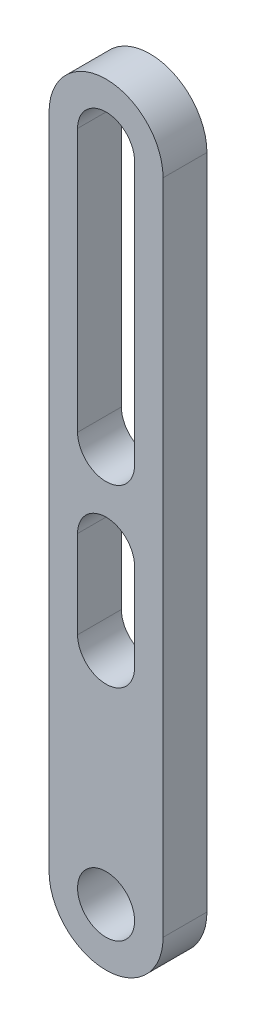
ISO-10303-21;
HEADER;
FILE_DESCRIPTION(('STEP AP214'),'2;1');
FILE_NAME('part.step','',(''),(''),'','','');
FILE_SCHEMA(('AUTOMOTIVE_DESIGN { 1 0 10303 214 1 1 1 1 }'));
ENDSEC;
DATA;
#1=APPLICATION_CONTEXT('core data for automotive mechanical design processes');
#2=APPLICATION_PROTOCOL_DEFINITION('international standard','automotive_design',2000,#1);
#3=PRODUCT_CONTEXT('',#1,'mechanical');
#4=PRODUCT('Part','Part','',(#3));
#5=PRODUCT_RELATED_PRODUCT_CATEGORY('part','',(#4));
#6=PRODUCT_DEFINITION_FORMATION('','',#4);
#7=PRODUCT_DEFINITION_CONTEXT('part definition',#1,'design');
#8=PRODUCT_DEFINITION('design','',#6,#7);
#9=PRODUCT_DEFINITION_SHAPE('','',#8);
#10=(LENGTH_UNIT() NAMED_UNIT(*) SI_UNIT(.MILLI.,.METRE.));
#11=(NAMED_UNIT(*) PLANE_ANGLE_UNIT() SI_UNIT($,.RADIAN.));
#12=(NAMED_UNIT(*) SI_UNIT($,.STERADIAN.) SOLID_ANGLE_UNIT());
#13=UNCERTAINTY_MEASURE_WITH_UNIT(LENGTH_MEASURE(1.E-05),#10,'distance_accuracy_value','');
#14=(GEOMETRIC_REPRESENTATION_CONTEXT(3) GLOBAL_UNCERTAINTY_ASSIGNED_CONTEXT((#13)) GLOBAL_UNIT_ASSIGNED_CONTEXT((#10,
#11,#12)) REPRESENTATION_CONTEXT('',''));
#15=CARTESIAN_POINT('',(0.,0.,0.));
#16=DIRECTION('',(0.,0.,1.));
#17=DIRECTION('',(1.,0.,0.));
#18=AXIS2_PLACEMENT_3D('',#15,#16,#17);
#19=CARTESIAN_POINT('',(0.,0.,5.));
#20=DIRECTION('',(0.,0.,1.));
#21=DIRECTION('',(1.,0.,0.));
#22=AXIS2_PLACEMENT_3D('',#19,#20,#21);
#23=PLANE('',#22);
#24=DIRECTION('',(0.,-1.,0.));
#25=VECTOR('',#24,1.);
#26=CARTESIAN_POINT('',(-3.25000000000001,75.,5.));
#27=LINE('',#26,#25);
#28=CARTESIAN_POINT('',(-3.25000000000001,75.,5.));
#29=VERTEX_POINT('',#28);
#30=CARTESIAN_POINT('',(-3.25,45.,5.));
#31=VERTEX_POINT('',#30);
#32=EDGE_CURVE('E157',#29,#31,#27,.T.);
#33=ORIENTED_EDGE('',*,*,#32,.F.);
#34=CARTESIAN_POINT('',(0.,75.,5.));
#35=DIRECTION('',(0.,0.,1.));
#36=DIRECTION('',(1.,0.,0.));
#37=AXIS2_PLACEMENT_3D('',#34,#35,#36);
#38=CIRCLE('',#37,3.25000000000001);
#39=CARTESIAN_POINT('',(3.25000000000001,75.,5.));
#40=VERTEX_POINT('',#39);
#41=EDGE_CURVE('E155',#40,#29,#38,.T.);
#42=ORIENTED_EDGE('',*,*,#41,.F.);
#43=DIRECTION('',(0.,1.,0.));
#44=VECTOR('',#43,1.);
#45=CARTESIAN_POINT('',(3.25,45.,5.));
#46=LINE('',#45,#44);
#47=CARTESIAN_POINT('',(3.25,45.,5.));
#48=VERTEX_POINT('',#47);
#49=EDGE_CURVE('E163',#48,#40,#46,.T.);
#50=ORIENTED_EDGE('',*,*,#49,.F.);
#51=CARTESIAN_POINT('',(0.,45.,5.));
#52=DIRECTION('',(0.,0.,1.));
#53=DIRECTION('',(1.,0.,0.));
#54=AXIS2_PLACEMENT_3D('',#51,#52,#53);
#55=CIRCLE('',#54,3.25);
#56=EDGE_CURVE('E160',#31,#48,#55,.T.);
#57=ORIENTED_EDGE('',*,*,#56,.F.);
#58=EDGE_LOOP('',(#33,#42,#50,#57));
#59=FACE_BOUND('',#58,.T.);
#60=CARTESIAN_POINT('',(0.,0.,5.));
#61=DIRECTION('',(0.,0.,1.));
#62=DIRECTION('',(1.,0.,0.));
#63=AXIS2_PLACEMENT_3D('',#60,#61,#62);
#64=CIRCLE('',#63,6.50000000000001);
#65=CARTESIAN_POINT('',(-6.50000000000001,0.,5.));
#66=VERTEX_POINT('',#65);
#67=CARTESIAN_POINT('',(6.50000000000001,0.,5.));
#68=VERTEX_POINT('',#67);
#69=EDGE_CURVE('E192',#66,#68,#64,.T.);
#70=ORIENTED_EDGE('',*,*,#69,.T.);
#71=DIRECTION('',(0.,1.,0.));
#72=VECTOR('',#71,1.);
#73=CARTESIAN_POINT('',(6.5,75.,5.));
#74=LINE('',#73,#72);
#75=CARTESIAN_POINT('',(6.5,75.,5.));
#76=VERTEX_POINT('',#75);
#77=EDGE_CURVE('E195',#68,#76,#74,.T.);
#78=ORIENTED_EDGE('',*,*,#77,.T.);
#79=CARTESIAN_POINT('',(0.,75.,5.));
#80=DIRECTION('',(0.,0.,1.));
#81=DIRECTION('',(1.,0.,0.));
#82=AXIS2_PLACEMENT_3D('',#79,#80,#81);
#83=CIRCLE('',#82,6.5);
#84=CARTESIAN_POINT('',(-6.5,75.,5.));
#85=VERTEX_POINT('',#84);
#86=EDGE_CURVE('E198',#76,#85,#83,.T.);
#87=ORIENTED_EDGE('',*,*,#86,.T.);
#88=DIRECTION('',(0.,-1.,0.));
#89=VECTOR('',#88,1.);
#90=CARTESIAN_POINT('',(-6.5,75.,5.));
#91=LINE('',#90,#89);
#92=EDGE_CURVE('E200',#85,#66,#91,.T.);
#93=ORIENTED_EDGE('',*,*,#92,.T.);
#94=EDGE_LOOP('',(#70,#78,#87,#93));
#95=FACE_BOUND('',#94,.T.);
#96=CARTESIAN_POINT('',(0.,0.,5.));
#97=DIRECTION('',(0.,0.,1.));
#98=DIRECTION('',(1.,0.,0.));
#99=AXIS2_PLACEMENT_3D('',#96,#97,#98);
#100=CIRCLE('',#99,3.25);
#101=CARTESIAN_POINT('',(3.25,0.,5.));
#102=VERTEX_POINT('',#101);
#103=EDGE_CURVE('E186',#102,#102,#100,.T.);
#104=ORIENTED_EDGE('',*,*,#103,.F.);
#105=EDGE_LOOP('',(#104));
#106=FACE_BOUND('',#105,.T.);
#107=DIRECTION('',(0.,-1.,0.));
#108=VECTOR('',#107,1.);
#109=CARTESIAN_POINT('',(-3.25000000000001,35.,5.));
#110=LINE('',#109,#108);
#111=CARTESIAN_POINT('',(-3.25000000000001,35.,5.));
#112=VERTEX_POINT('',#111);
#113=CARTESIAN_POINT('',(-3.25000000000001,25.,5.));
#114=VERTEX_POINT('',#113);
#115=EDGE_CURVE('E127',#112,#114,#110,.T.);
#116=ORIENTED_EDGE('',*,*,#115,.F.);
#117=CARTESIAN_POINT('',(0.,35.,5.));
#118=DIRECTION('',(0.,0.,1.));
#119=DIRECTION('',(1.,0.,0.));
#120=AXIS2_PLACEMENT_3D('',#117,#118,#119);
#121=CIRCLE('',#120,3.25000000000001);
#122=CARTESIAN_POINT('',(3.25000000000001,35.,5.));
#123=VERTEX_POINT('',#122);
#124=EDGE_CURVE('E119',#123,#112,#121,.T.);
#125=ORIENTED_EDGE('',*,*,#124,.F.);
#126=DIRECTION('',(0.,1.,0.));
#127=VECTOR('',#126,1.);
#128=CARTESIAN_POINT('',(3.25000000000001,35.,5.));
#129=LINE('',#128,#127);
#130=CARTESIAN_POINT('',(3.25000000000001,25.,5.));
#131=VERTEX_POINT('',#130);
#132=EDGE_CURVE('E141',#131,#123,#129,.T.);
#133=ORIENTED_EDGE('',*,*,#132,.F.);
#134=CARTESIAN_POINT('',(0.,25.,5.));
#135=DIRECTION('',(0.,0.,1.));
#136=DIRECTION('',(1.,0.,0.));
#137=AXIS2_PLACEMENT_3D('',#134,#135,#136);
#138=CIRCLE('',#137,3.25000000000001);
#139=EDGE_CURVE('E139',#114,#131,#138,.T.);
#140=ORIENTED_EDGE('',*,*,#139,.F.);
#141=EDGE_LOOP('',(#116,#125,#133,#140));
#142=FACE_BOUND('',#141,.T.);
#143=ADVANCED_FACE('F30',(#59,#95,#106,#142),#23,.T.);
#144=CARTESIAN_POINT('',(0.,0.,0.));
#145=DIRECTION('',(0.,0.,1.));
#146=DIRECTION('',(1.,0.,0.));
#147=AXIS2_PLACEMENT_3D('',#144,#145,#146);
#148=PLANE('',#147);
#149=CARTESIAN_POINT('',(0.,75.,0.));
#150=DIRECTION('',(0.,0.,1.));
#151=DIRECTION('',(1.,0.,0.));
#152=AXIS2_PLACEMENT_3D('',#149,#150,#151);
#153=CIRCLE('',#152,3.25000000000001);
#154=CARTESIAN_POINT('',(3.25000000000001,75.,0.));
#155=VERTEX_POINT('',#154);
#156=CARTESIAN_POINT('',(-3.25000000000001,75.,0.));
#157=VERTEX_POINT('',#156);
#158=EDGE_CURVE('E135',#155,#157,#153,.T.);
#159=ORIENTED_EDGE('',*,*,#158,.T.);
#160=DIRECTION('',(0.,-1.,0.));
#161=VECTOR('',#160,1.);
#162=CARTESIAN_POINT('',(-3.25000000000001,75.,0.));
#163=LINE('',#162,#161);
#164=CARTESIAN_POINT('',(-3.25,45.,0.));
#165=VERTEX_POINT('',#164);
#166=EDGE_CURVE('E168',#157,#165,#163,.T.);
#167=ORIENTED_EDGE('',*,*,#166,.T.);
#168=CARTESIAN_POINT('',(0.,45.,0.));
#169=DIRECTION('',(0.,0.,1.));
#170=DIRECTION('',(1.,0.,0.));
#171=AXIS2_PLACEMENT_3D('',#168,#169,#170);
#172=CIRCLE('',#171,3.25);
#173=CARTESIAN_POINT('',(3.25,45.,0.));
#174=VERTEX_POINT('',#173);
#175=EDGE_CURVE('E171',#165,#174,#172,.T.);
#176=ORIENTED_EDGE('',*,*,#175,.T.);
#177=DIRECTION('',(0.,1.,0.));
#178=VECTOR('',#177,1.);
#179=CARTESIAN_POINT('',(3.25,45.,0.));
#180=LINE('',#179,#178);
#181=EDGE_CURVE('E158',#174,#155,#180,.T.);
#182=ORIENTED_EDGE('',*,*,#181,.T.);
#183=EDGE_LOOP('',(#159,#167,#176,#182));
#184=FACE_BOUND('',#183,.T.);
#185=CARTESIAN_POINT('',(0.,0.,0.));
#186=DIRECTION('',(0.,0.,1.));
#187=DIRECTION('',(1.,0.,0.));
#188=AXIS2_PLACEMENT_3D('',#185,#186,#187);
#189=CIRCLE('',#188,6.50000000000001);
#190=CARTESIAN_POINT('',(-6.50000000000001,0.,0.));
#191=VERTEX_POINT('',#190);
#192=CARTESIAN_POINT('',(6.50000000000001,0.,0.));
#193=VERTEX_POINT('',#192);
#194=EDGE_CURVE('E189',#191,#193,#189,.T.);
#195=ORIENTED_EDGE('',*,*,#194,.F.);
#196=DIRECTION('',(0.,-1.,0.));
#197=VECTOR('',#196,1.);
#198=CARTESIAN_POINT('',(-6.5,75.,0.));
#199=LINE('',#198,#197);
#200=CARTESIAN_POINT('',(-6.5,75.,0.));
#201=VERTEX_POINT('',#200);
#202=EDGE_CURVE('E196',#201,#191,#199,.T.);
#203=ORIENTED_EDGE('',*,*,#202,.F.);
#204=CARTESIAN_POINT('',(0.,75.,0.));
#205=DIRECTION('',(0.,0.,1.));
#206=DIRECTION('',(1.,0.,0.));
#207=AXIS2_PLACEMENT_3D('',#204,#205,#206);
#208=CIRCLE('',#207,6.5);
#209=CARTESIAN_POINT('',(6.5,75.,0.));
#210=VERTEX_POINT('',#209);
#211=EDGE_CURVE('E207',#210,#201,#208,.T.);
#212=ORIENTED_EDGE('',*,*,#211,.F.);
#213=DIRECTION('',(0.,1.,0.));
#214=VECTOR('',#213,1.);
#215=CARTESIAN_POINT('',(6.5,75.,0.));
#216=LINE('',#215,#214);
#217=EDGE_CURVE('E205',#193,#210,#216,.T.);
#218=ORIENTED_EDGE('',*,*,#217,.F.);
#219=EDGE_LOOP('',(#195,#203,#212,#218));
#220=FACE_BOUND('',#219,.T.);
#221=CARTESIAN_POINT('',(0.,0.,0.));
#222=DIRECTION('',(0.,0.,1.));
#223=DIRECTION('',(1.,0.,0.));
#224=AXIS2_PLACEMENT_3D('',#221,#222,#223);
#225=CIRCLE('',#224,3.25);
#226=CARTESIAN_POINT('',(3.25,0.,0.));
#227=VERTEX_POINT('',#226);
#228=EDGE_CURVE('E185',#227,#227,#225,.T.);
#229=ORIENTED_EDGE('',*,*,#228,.T.);
#230=EDGE_LOOP('',(#229));
#231=FACE_BOUND('',#230,.T.);
#232=CARTESIAN_POINT('',(0.,35.,0.));
#233=DIRECTION('',(0.,0.,1.));
#234=DIRECTION('',(1.,0.,0.));
#235=AXIS2_PLACEMENT_3D('',#232,#233,#234);
#236=CIRCLE('',#235,3.25000000000001);
#237=CARTESIAN_POINT('',(3.25000000000001,35.,0.));
#238=VERTEX_POINT('',#237);
#239=CARTESIAN_POINT('',(-3.25000000000001,35.,0.));
#240=VERTEX_POINT('',#239);
#241=EDGE_CURVE('E53',#238,#240,#236,.T.);
#242=ORIENTED_EDGE('',*,*,#241,.T.);
#243=DIRECTION('',(0.,-1.,0.));
#244=VECTOR('',#243,1.);
#245=CARTESIAN_POINT('',(-3.25000000000001,35.,0.));
#246=LINE('',#245,#244);
#247=CARTESIAN_POINT('',(-3.25000000000001,25.,0.));
#248=VERTEX_POINT('',#247);
#249=EDGE_CURVE('E134',#240,#248,#246,.T.);
#250=ORIENTED_EDGE('',*,*,#249,.T.);
#251=CARTESIAN_POINT('',(0.,25.,0.));
#252=DIRECTION('',(0.,0.,1.));
#253=DIRECTION('',(1.,0.,0.));
#254=AXIS2_PLACEMENT_3D('',#251,#252,#253);
#255=CIRCLE('',#254,3.25000000000001);
#256=CARTESIAN_POINT('',(3.25000000000001,25.,0.));
#257=VERTEX_POINT('',#256);
#258=EDGE_CURVE('E147',#248,#257,#255,.T.);
#259=ORIENTED_EDGE('',*,*,#258,.T.);
#260=DIRECTION('',(0.,1.,0.));
#261=VECTOR('',#260,1.);
#262=CARTESIAN_POINT('',(3.25000000000001,35.,0.));
#263=LINE('',#262,#261);
#264=EDGE_CURVE('E128',#257,#238,#263,.T.);
#265=ORIENTED_EDGE('',*,*,#264,.T.);
#266=EDGE_LOOP('',(#242,#250,#259,#265));
#267=FACE_BOUND('',#266,.T.);
#268=ADVANCED_FACE('F225',(#184,#220,#231,#267),#148,.F.);
#269=CARTESIAN_POINT('',(0.,0.,5.));
#270=DIRECTION('',(0.,0.,-1.));
#271=DIRECTION('',(-1.,0.,0.));
#272=AXIS2_PLACEMENT_3D('',#269,#270,#271);
#273=CYLINDRICAL_SURFACE('',#272,6.50000000000001);
#274=ORIENTED_EDGE('',*,*,#194,.T.);
#275=DIRECTION('',(0.,0.,-1.));
#276=VECTOR('',#275,1.);
#277=CARTESIAN_POINT('',(6.50000000000001,0.,5.));
#278=LINE('',#277,#276);
#279=EDGE_CURVE('E11',#68,#193,#278,.T.);
#280=ORIENTED_EDGE('',*,*,#279,.F.);
#281=ORIENTED_EDGE('',*,*,#69,.F.);
#282=DIRECTION('',(0.,0.,-1.));
#283=VECTOR('',#282,1.);
#284=CARTESIAN_POINT('',(-6.50000000000001,0.,5.));
#285=LINE('',#284,#283);
#286=EDGE_CURVE('E202',#66,#191,#285,.T.);
#287=ORIENTED_EDGE('',*,*,#286,.T.);
#288=EDGE_LOOP('',(#274,#280,#281,#287));
#289=FACE_BOUND('',#288,.T.);
#290=ADVANCED_FACE('F32',(#289),#273,.T.);
#291=CARTESIAN_POINT('',(6.5,75.,5.));
#292=DIRECTION('',(-1.,0.,0.));
#293=DIRECTION('',(0.,-1.,0.));
#294=AXIS2_PLACEMENT_3D('',#291,#292,#293);
#295=PLANE('',#294);
#296=ORIENTED_EDGE('',*,*,#217,.T.);
#297=DIRECTION('',(0.,0.,-1.));
#298=VECTOR('',#297,1.);
#299=CARTESIAN_POINT('',(6.5,75.,5.));
#300=LINE('',#299,#298);
#301=EDGE_CURVE('E38',#76,#210,#300,.T.);
#302=ORIENTED_EDGE('',*,*,#301,.F.);
#303=ORIENTED_EDGE('',*,*,#77,.F.);
#304=ORIENTED_EDGE('',*,*,#279,.T.);
#305=EDGE_LOOP('',(#296,#302,#303,#304));
#306=FACE_BOUND('',#305,.T.);
#307=ADVANCED_FACE('F236',(#306),#295,.F.);
#308=CARTESIAN_POINT('',(0.,75.,5.));
#309=DIRECTION('',(0.,0.,-1.));
#310=DIRECTION('',(-1.,0.,0.));
#311=AXIS2_PLACEMENT_3D('',#308,#309,#310);
#312=CYLINDRICAL_SURFACE('',#311,6.5);
#313=ORIENTED_EDGE('',*,*,#211,.T.);
#314=DIRECTION('',(0.,0.,-1.));
#315=VECTOR('',#314,1.);
#316=CARTESIAN_POINT('',(-6.5,75.,5.));
#317=LINE('',#316,#315);
#318=EDGE_CURVE('E212',#85,#201,#317,.T.);
#319=ORIENTED_EDGE('',*,*,#318,.F.);
#320=ORIENTED_EDGE('',*,*,#86,.F.);
#321=ORIENTED_EDGE('',*,*,#301,.T.);
#322=EDGE_LOOP('',(#313,#319,#320,#321));
#323=FACE_BOUND('',#322,.T.);
#324=ADVANCED_FACE('F219',(#323),#312,.T.);
#325=CARTESIAN_POINT('',(-6.5,75.,5.));
#326=DIRECTION('',(1.,0.,0.));
#327=DIRECTION('',(0.,1.,0.));
#328=AXIS2_PLACEMENT_3D('',#325,#326,#327);
#329=PLANE('',#328);
#330=ORIENTED_EDGE('',*,*,#202,.T.);
#331=ORIENTED_EDGE('',*,*,#286,.F.);
#332=ORIENTED_EDGE('',*,*,#92,.F.);
#333=ORIENTED_EDGE('',*,*,#318,.T.);
#334=EDGE_LOOP('',(#330,#331,#332,#333));
#335=FACE_BOUND('',#334,.T.);
#336=ADVANCED_FACE('F229',(#335),#329,.F.);
#337=CARTESIAN_POINT('',(0.,0.,5.));
#338=DIRECTION('',(0.,0.,-1.));
#339=DIRECTION('',(-1.,0.,0.));
#340=AXIS2_PLACEMENT_3D('',#337,#338,#339);
#341=CYLINDRICAL_SURFACE('',#340,3.25);
#342=ORIENTED_EDGE('',*,*,#103,.T.);
#343=EDGE_LOOP('',(#342));
#344=FACE_BOUND('',#343,.T.);
#345=ORIENTED_EDGE('',*,*,#228,.F.);
#346=EDGE_LOOP('',(#345));
#347=FACE_BOUND('',#346,.T.);
#348=ADVANCED_FACE('F253',(#344,#347),#341,.F.);
#349=CARTESIAN_POINT('',(0.,75.,5.));
#350=DIRECTION('',(0.,0.,-1.));
#351=DIRECTION('',(-1.,0.,0.));
#352=AXIS2_PLACEMENT_3D('',#349,#350,#351);
#353=CYLINDRICAL_SURFACE('',#352,3.25000000000001);
#354=ORIENTED_EDGE('',*,*,#158,.F.);
#355=DIRECTION('',(0.,0.,-1.));
#356=VECTOR('',#355,1.);
#357=CARTESIAN_POINT('',(3.25000000000001,75.,5.));
#358=LINE('',#357,#356);
#359=EDGE_CURVE('E165',#40,#155,#358,.T.);
#360=ORIENTED_EDGE('',*,*,#359,.F.);
#361=ORIENTED_EDGE('',*,*,#41,.T.);
#362=DIRECTION('',(0.,0.,-1.));
#363=VECTOR('',#362,1.);
#364=CARTESIAN_POINT('',(-3.25000000000001,75.,5.));
#365=LINE('',#364,#363);
#366=EDGE_CURVE('E182',#29,#157,#365,.T.);
#367=ORIENTED_EDGE('',*,*,#366,.T.);
#368=EDGE_LOOP('',(#354,#360,#361,#367));
#369=FACE_BOUND('',#368,.T.);
#370=ADVANCED_FACE('F260',(#369),#353,.F.);
#371=CARTESIAN_POINT('',(-3.25000000000001,75.,5.));
#372=DIRECTION('',(1.,0.,0.));
#373=DIRECTION('',(0.,1.,0.));
#374=AXIS2_PLACEMENT_3D('',#371,#372,#373);
#375=PLANE('',#374);
#376=ORIENTED_EDGE('',*,*,#166,.F.);
#377=ORIENTED_EDGE('',*,*,#366,.F.);
#378=ORIENTED_EDGE('',*,*,#32,.T.);
#379=DIRECTION('',(0.,0.,-1.));
#380=VECTOR('',#379,1.);
#381=CARTESIAN_POINT('',(-3.25,45.,5.));
#382=LINE('',#381,#380);
#383=EDGE_CURVE('E180',#31,#165,#382,.T.);
#384=ORIENTED_EDGE('',*,*,#383,.T.);
#385=EDGE_LOOP('',(#376,#377,#378,#384));
#386=FACE_BOUND('',#385,.T.);
#387=ADVANCED_FACE('F265',(#386),#375,.T.);
#388=CARTESIAN_POINT('',(0.,45.,5.));
#389=DIRECTION('',(0.,0.,-1.));
#390=DIRECTION('',(-1.,0.,0.));
#391=AXIS2_PLACEMENT_3D('',#388,#389,#390);
#392=CYLINDRICAL_SURFACE('',#391,3.25);
#393=ORIENTED_EDGE('',*,*,#175,.F.);
#394=ORIENTED_EDGE('',*,*,#383,.F.);
#395=ORIENTED_EDGE('',*,*,#56,.T.);
#396=DIRECTION('',(0.,0.,-1.));
#397=VECTOR('',#396,1.);
#398=CARTESIAN_POINT('',(3.25,45.,5.));
#399=LINE('',#398,#397);
#400=EDGE_CURVE('E178',#48,#174,#399,.T.);
#401=ORIENTED_EDGE('',*,*,#400,.T.);
#402=EDGE_LOOP('',(#393,#394,#395,#401));
#403=FACE_BOUND('',#402,.T.);
#404=ADVANCED_FACE('F289',(#403),#392,.F.);
#405=CARTESIAN_POINT('',(3.25,45.,5.));
#406=DIRECTION('',(-1.,0.,0.));
#407=DIRECTION('',(0.,-1.,0.));
#408=AXIS2_PLACEMENT_3D('',#405,#406,#407);
#409=PLANE('',#408);
#410=ORIENTED_EDGE('',*,*,#181,.F.);
#411=ORIENTED_EDGE('',*,*,#400,.F.);
#412=ORIENTED_EDGE('',*,*,#49,.T.);
#413=ORIENTED_EDGE('',*,*,#359,.T.);
#414=EDGE_LOOP('',(#410,#411,#412,#413));
#415=FACE_BOUND('',#414,.T.);
#416=ADVANCED_FACE('F286',(#415),#409,.T.);
#417=CARTESIAN_POINT('',(0.,35.,5.));
#418=DIRECTION('',(0.,0.,-1.));
#419=DIRECTION('',(-1.,0.,0.));
#420=AXIS2_PLACEMENT_3D('',#417,#418,#419);
#421=CYLINDRICAL_SURFACE('',#420,3.25000000000001);
#422=ORIENTED_EDGE('',*,*,#241,.F.);
#423=DIRECTION('',(0.,0.,-1.));
#424=VECTOR('',#423,1.);
#425=CARTESIAN_POINT('',(3.25000000000001,35.,5.));
#426=LINE('',#425,#424);
#427=EDGE_CURVE('E123',#123,#238,#426,.T.);
#428=ORIENTED_EDGE('',*,*,#427,.F.);
#429=ORIENTED_EDGE('',*,*,#124,.T.);
#430=DIRECTION('',(0.,0.,-1.));
#431=VECTOR('',#430,1.);
#432=CARTESIAN_POINT('',(-3.25000000000001,35.,5.));
#433=LINE('',#432,#431);
#434=EDGE_CURVE('E122',#112,#240,#433,.T.);
#435=ORIENTED_EDGE('',*,*,#434,.T.);
#436=EDGE_LOOP('',(#422,#428,#429,#435));
#437=FACE_BOUND('',#436,.T.);
#438=ADVANCED_FACE('F121',(#437),#421,.F.);
#439=CARTESIAN_POINT('',(-3.25000000000001,35.,5.));
#440=DIRECTION('',(1.,0.,0.));
#441=DIRECTION('',(0.,0.,-1.));
#442=AXIS2_PLACEMENT_3D('',#439,#440,#441);
#443=PLANE('',#442);
#444=ORIENTED_EDGE('',*,*,#249,.F.);
#445=ORIENTED_EDGE('',*,*,#434,.F.);
#446=ORIENTED_EDGE('',*,*,#115,.T.);
#447=DIRECTION('',(0.,0.,-1.));
#448=VECTOR('',#447,1.);
#449=CARTESIAN_POINT('',(-3.25000000000001,25.,5.));
#450=LINE('',#449,#448);
#451=EDGE_CURVE('E136',#114,#248,#450,.T.);
#452=ORIENTED_EDGE('',*,*,#451,.T.);
#453=EDGE_LOOP('',(#444,#445,#446,#452));
#454=FACE_BOUND('',#453,.T.);
#455=ADVANCED_FACE('F131',(#454),#443,.T.);
#456=CARTESIAN_POINT('',(0.,25.,5.));
#457=DIRECTION('',(0.,0.,-1.));
#458=DIRECTION('',(-1.,0.,0.));
#459=AXIS2_PLACEMENT_3D('',#456,#457,#458);
#460=CYLINDRICAL_SURFACE('',#459,3.25000000000001);
#461=ORIENTED_EDGE('',*,*,#258,.F.);
#462=ORIENTED_EDGE('',*,*,#451,.F.);
#463=ORIENTED_EDGE('',*,*,#139,.T.);
#464=DIRECTION('',(0.,0.,-1.));
#465=VECTOR('',#464,1.);
#466=CARTESIAN_POINT('',(3.25000000000001,25.,5.));
#467=LINE('',#466,#465);
#468=EDGE_CURVE('E45',#131,#257,#467,.T.);
#469=ORIENTED_EDGE('',*,*,#468,.T.);
#470=EDGE_LOOP('',(#461,#462,#463,#469));
#471=FACE_BOUND('',#470,.T.);
#472=ADVANCED_FACE('F274',(#471),#460,.F.);
#473=CARTESIAN_POINT('',(3.25000000000001,35.,5.));
#474=DIRECTION('',(-1.,0.,0.));
#475=DIRECTION('',(0.,0.,1.));
#476=AXIS2_PLACEMENT_3D('',#473,#474,#475);
#477=PLANE('',#476);
#478=ORIENTED_EDGE('',*,*,#264,.F.);
#479=ORIENTED_EDGE('',*,*,#468,.F.);
#480=ORIENTED_EDGE('',*,*,#132,.T.);
#481=ORIENTED_EDGE('',*,*,#427,.T.);
#482=EDGE_LOOP('',(#478,#479,#480,#481));
#483=FACE_BOUND('',#482,.T.);
#484=ADVANCED_FACE('F272',(#483),#477,.T.);
#485=CLOSED_SHELL('',(#143,#268,#290,#307,#324,#336,#348,#370,#387,#404,#416,#438,#455,#472,#484));
#486=MANIFOLD_SOLID_BREP('B2',#485);
#487=ADVANCED_BREP_SHAPE_REPRESENTATION('',(#18,#486),#14);
#488=SHAPE_DEFINITION_REPRESENTATION(#9,#487);
ENDSEC;
END-ISO-10303-21;
